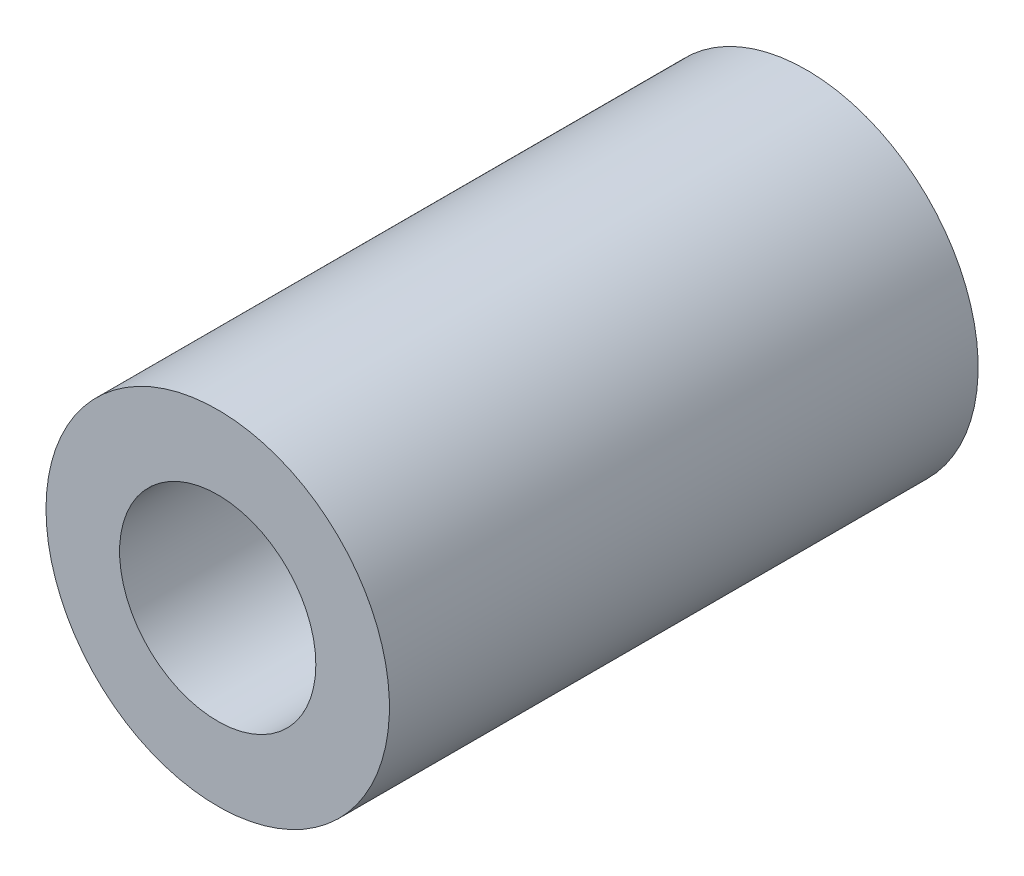
ISO-10303-21;
HEADER;
FILE_DESCRIPTION(('STEP AP214'),'2;1');
FILE_NAME('part.step','',(''),(''),'','','');
FILE_SCHEMA(('AUTOMOTIVE_DESIGN { 1 0 10303 214 1 1 1 1 }'));
ENDSEC;
DATA;
#1=APPLICATION_CONTEXT('core data for automotive mechanical design processes');
#2=APPLICATION_PROTOCOL_DEFINITION('international standard','automotive_design',2000,#1);
#3=PRODUCT_CONTEXT('',#1,'mechanical');
#4=PRODUCT('Part','Part','',(#3));
#5=PRODUCT_RELATED_PRODUCT_CATEGORY('part','',(#4));
#6=PRODUCT_DEFINITION_FORMATION('','',#4);
#7=PRODUCT_DEFINITION_CONTEXT('part definition',#1,'design');
#8=PRODUCT_DEFINITION('design','',#6,#7);
#9=PRODUCT_DEFINITION_SHAPE('','',#8);
#10=(LENGTH_UNIT() NAMED_UNIT(*) SI_UNIT(.MILLI.,.METRE.));
#11=(NAMED_UNIT(*) PLANE_ANGLE_UNIT() SI_UNIT($,.RADIAN.));
#12=(NAMED_UNIT(*) SI_UNIT($,.STERADIAN.) SOLID_ANGLE_UNIT());
#13=UNCERTAINTY_MEASURE_WITH_UNIT(LENGTH_MEASURE(1.E-05),#10,'distance_accuracy_value','');
#14=(GEOMETRIC_REPRESENTATION_CONTEXT(3) GLOBAL_UNCERTAINTY_ASSIGNED_CONTEXT((#13)) GLOBAL_UNIT_ASSIGNED_CONTEXT((#10,
#11,#12)) REPRESENTATION_CONTEXT('',''));
#15=CARTESIAN_POINT('',(0.,0.,0.));
#16=DIRECTION('',(0.,0.,1.));
#17=DIRECTION('',(1.,0.,0.));
#18=AXIS2_PLACEMENT_3D('',#15,#16,#17);
#19=CARTESIAN_POINT('',(0.,0.,19.05));
#20=DIRECTION('',(0.,0.,-1.));
#21=DIRECTION('',(-1.,0.,0.));
#22=AXIS2_PLACEMENT_3D('',#19,#20,#21);
#23=CYLINDRICAL_SURFACE('',#22,11.1125);
#24=CARTESIAN_POINT('',(0.,0.,19.05));
#25=DIRECTION('',(0.,0.,1.));
#26=DIRECTION('',(1.,0.,0.));
#27=AXIS2_PLACEMENT_3D('',#24,#25,#26);
#28=CIRCLE('',#27,11.1125);
#29=CARTESIAN_POINT('',(-11.1125,0.,19.05));
#30=VERTEX_POINT('',#29);
#31=EDGE_CURVE('E10',#30,#30,#28,.T.);
#32=CARTESIAN_POINT('',(0.,0.,-19.05));
#33=DIRECTION('',(0.,0.,1.));
#34=DIRECTION('',(1.,0.,0.));
#35=AXIS2_PLACEMENT_3D('',#32,#33,#34);
#36=CIRCLE('',#35,11.1125);
#37=CARTESIAN_POINT('',(-11.1125,0.,-19.05));
#38=VERTEX_POINT('',#37);
#39=EDGE_CURVE('E38',#38,#38,#36,.T.);
#40=CARTESIAN_POINT('',(-11.1125,0.,19.05));
#41=CARTESIAN_POINT('',(-11.1125,0.,18.653125));
#42=CARTESIAN_POINT('',(-11.1125,0.,18.25625));
#43=CARTESIAN_POINT('',(-11.1125,0.,17.4625));
#44=CARTESIAN_POINT('',(-11.1125,0.,17.065625));
#45=CARTESIAN_POINT('',(-11.1125,0.,16.271875));
#46=CARTESIAN_POINT('',(-11.1125,0.,15.875));
#47=CARTESIAN_POINT('',(-11.1125,0.,15.08125));
#48=CARTESIAN_POINT('',(-11.1125,0.,14.684375));
#49=CARTESIAN_POINT('',(-11.1125,0.,13.890625));
#50=CARTESIAN_POINT('',(-11.1125,0.,13.49375));
#51=CARTESIAN_POINT('',(-11.1125,0.,12.7));
#52=CARTESIAN_POINT('',(-11.1125,0.,12.303125));
#53=CARTESIAN_POINT('',(-11.1125,0.,11.509375));
#54=CARTESIAN_POINT('',(-11.1125,0.,11.1125));
#55=CARTESIAN_POINT('',(-11.1125,0.,10.31875));
#56=CARTESIAN_POINT('',(-11.1125,0.,9.921875));
#57=CARTESIAN_POINT('',(-11.1125,0.,9.128125));
#58=CARTESIAN_POINT('',(-11.1125,0.,8.73125));
#59=CARTESIAN_POINT('',(-11.1125,0.,7.9375));
#60=CARTESIAN_POINT('',(-11.1125,0.,7.540625));
#61=CARTESIAN_POINT('',(-11.1125,0.,6.746875));
#62=CARTESIAN_POINT('',(-11.1125,0.,6.35));
#63=CARTESIAN_POINT('',(-11.1125,0.,5.55625));
#64=CARTESIAN_POINT('',(-11.1125,0.,5.159375));
#65=CARTESIAN_POINT('',(-11.1125,0.,4.365625));
#66=CARTESIAN_POINT('',(-11.1125,0.,3.96875));
#67=CARTESIAN_POINT('',(-11.1125,0.,3.175));
#68=CARTESIAN_POINT('',(-11.1125,0.,2.778125));
#69=CARTESIAN_POINT('',(-11.1125,0.,1.984375));
#70=CARTESIAN_POINT('',(-11.1125,0.,1.5875));
#71=CARTESIAN_POINT('',(-11.1125,0.,0.79375));
#72=CARTESIAN_POINT('',(-11.1125,0.,0.396875));
#73=CARTESIAN_POINT('',(-11.1125,0.,-0.396875));
#74=CARTESIAN_POINT('',(-11.1125,0.,-0.79375));
#75=CARTESIAN_POINT('',(-11.1125,0.,-1.5875));
#76=CARTESIAN_POINT('',(-11.1125,0.,-1.984375));
#77=CARTESIAN_POINT('',(-11.1125,0.,-2.778125));
#78=CARTESIAN_POINT('',(-11.1125,0.,-3.175));
#79=CARTESIAN_POINT('',(-11.1125,0.,-3.96875));
#80=CARTESIAN_POINT('',(-11.1125,0.,-4.365625));
#81=CARTESIAN_POINT('',(-11.1125,0.,-5.159375));
#82=CARTESIAN_POINT('',(-11.1125,0.,-5.55625));
#83=CARTESIAN_POINT('',(-11.1125,0.,-6.35));
#84=CARTESIAN_POINT('',(-11.1125,0.,-6.746875));
#85=CARTESIAN_POINT('',(-11.1125,0.,-7.540625));
#86=CARTESIAN_POINT('',(-11.1125,0.,-7.9375));
#87=CARTESIAN_POINT('',(-11.1125,0.,-8.73125));
#88=CARTESIAN_POINT('',(-11.1125,0.,-9.128125));
#89=CARTESIAN_POINT('',(-11.1125,0.,-9.921875));
#90=CARTESIAN_POINT('',(-11.1125,0.,-10.31875));
#91=CARTESIAN_POINT('',(-11.1125,0.,-11.1125));
#92=CARTESIAN_POINT('',(-11.1125,0.,-11.509375));
#93=CARTESIAN_POINT('',(-11.1125,0.,-12.303125));
#94=CARTESIAN_POINT('',(-11.1125,0.,-12.7));
#95=CARTESIAN_POINT('',(-11.1125,0.,-13.49375));
#96=CARTESIAN_POINT('',(-11.1125,0.,-13.890625));
#97=CARTESIAN_POINT('',(-11.1125,0.,-14.684375));
#98=CARTESIAN_POINT('',(-11.1125,0.,-15.08125));
#99=CARTESIAN_POINT('',(-11.1125,0.,-15.875));
#100=CARTESIAN_POINT('',(-11.1125,0.,-16.271875));
#101=CARTESIAN_POINT('',(-11.1125,0.,-17.065625));
#102=CARTESIAN_POINT('',(-11.1125,0.,-17.4625));
#103=CARTESIAN_POINT('',(-11.1125,0.,-18.25625));
#104=CARTESIAN_POINT('',(-11.1125,0.,-18.653125));
#105=CARTESIAN_POINT('',(-11.1125,0.,-19.05));
#106=B_SPLINE_CURVE_WITH_KNOTS('',3,(#40,#41,#42,#43,#44,#45,#46,#47,#48,#49,#50,#51,#52,#53,
#54,#55,#56,#57,#58,#59,#60,#61,#62,#63,#64,#65,#66,#67,#68,#69,#70,#71,#72,#73,#74,#75,#76,#77,
#78,#79,#80,#81,#82,#83,#84,#85,#86,#87,#88,#89,#90,#91,#92,#93,#94,#95,#96,#97,#98,#99,#100,
#101,#102,#103,#104,#105),.UNSPECIFIED.,.F.,.F.,(4,2,2,2,2,2,2,2,2,2,2,2,2,2,2,2,2,2,2,2,2,2,2,
2,2,2,2,2,2,2,2,2,4),(0.,1.190625,2.38125,3.571875,4.7625,5.953125,7.14375,8.334375,9.525,
10.715625,11.90625,13.096875,14.2875,15.478125,16.66875,17.859375,19.05,20.240625,21.43125,
22.621875,23.8125,25.003125,26.19375,27.384375,28.575,29.765625,30.95625,32.146875,33.3375,
34.528125,35.71875,36.909375,38.1),.UNSPECIFIED.);
#107=EDGE_CURVE('BSEAM31',#30,#38,#106,.T.);
#108=ORIENTED_EDGE('',*,*,#31,.F.);
#109=ORIENTED_EDGE('',*,*,#39,.T.);
#110=ORIENTED_EDGE('',*,*,#107,.T.);
#111=ORIENTED_EDGE('',*,*,#107,.F.);
#112=EDGE_LOOP('',(#108,#110,#109,#111));
#113=FACE_BOUND('',#112,.T.);
#114=ADVANCED_FACE('F31',(#113),#23,.T.);
#115=CARTESIAN_POINT('',(0.,0.,19.05));
#116=DIRECTION('',(0.,0.,1.));
#117=DIRECTION('',(1.,0.,0.));
#118=AXIS2_PLACEMENT_3D('',#115,#116,#117);
#119=PLANE('',#118);
#120=CARTESIAN_POINT('',(0.,0.,19.05));
#121=DIRECTION('',(0.,0.,1.));
#122=DIRECTION('',(1.,0.,0.));
#123=AXIS2_PLACEMENT_3D('',#120,#121,#122);
#124=CIRCLE('',#123,6.35);
#125=CARTESIAN_POINT('',(6.35,0.,19.05));
#126=VERTEX_POINT('',#125);
#127=EDGE_CURVE('E47',#126,#126,#124,.T.);
#128=ORIENTED_EDGE('',*,*,#127,.F.);
#129=EDGE_LOOP('',(#128));
#130=FACE_BOUND('',#129,.T.);
#131=ORIENTED_EDGE('',*,*,#31,.T.);
#132=EDGE_LOOP('',(#131));
#133=FACE_BOUND('',#132,.T.);
#134=ADVANCED_FACE('F71',(#130,#133),#119,.T.);
#135=CARTESIAN_POINT('',(0.,0.,-19.05));
#136=DIRECTION('',(0.,0.,1.));
#137=DIRECTION('',(1.,0.,0.));
#138=AXIS2_PLACEMENT_3D('',#135,#136,#137);
#139=PLANE('',#138);
#140=CARTESIAN_POINT('',(0.,0.,-19.05));
#141=DIRECTION('',(0.,0.,1.));
#142=DIRECTION('',(1.,0.,0.));
#143=AXIS2_PLACEMENT_3D('',#140,#141,#142);
#144=CIRCLE('',#143,3.2639);
#145=CARTESIAN_POINT('',(3.2639,0.,-19.05));
#146=VERTEX_POINT('',#145);
#147=EDGE_CURVE('E50',#146,#146,#144,.T.);
#148=ORIENTED_EDGE('',*,*,#147,.T.);
#149=EDGE_LOOP('',(#148));
#150=FACE_BOUND('',#149,.T.);
#151=ORIENTED_EDGE('',*,*,#39,.F.);
#152=EDGE_LOOP('',(#151));
#153=FACE_BOUND('',#152,.T.);
#154=ADVANCED_FACE('F76',(#150,#153),#139,.F.);
#155=CARTESIAN_POINT('',(0.,0.,-3.302));
#156=DIRECTION('',(0.,0.,1.));
#157=DIRECTION('',(1.,0.,0.));
#158=AXIS2_PLACEMENT_3D('',#155,#156,#157);
#159=CONICAL_SURFACE('',#158,6.34999999999999,1.02974425867665);
#160=CARTESIAN_POINT('',(0.,0.,-5.15631595638095));
#161=DIRECTION('',(0.,0.,1.));
#162=DIRECTION('',(1.,0.,0.));
#163=AXIS2_PLACEMENT_3D('',#160,#161,#162);
#164=CIRCLE('',#163,3.2639);
#165=CARTESIAN_POINT('',(3.2639,0.,-5.15631595638095));
#166=VERTEX_POINT('',#165);
#167=EDGE_CURVE('E34',#166,#166,#164,.F.);
#168=ORIENTED_EDGE('',*,*,#167,.T.);
#169=EDGE_LOOP('',(#168));
#170=FACE_BOUND('',#169,.T.);
#171=CARTESIAN_POINT('',(0.,0.,-3.302));
#172=DIRECTION('',(0.,0.,1.));
#173=DIRECTION('',(1.,0.,0.));
#174=AXIS2_PLACEMENT_3D('',#171,#172,#173);
#175=CIRCLE('',#174,6.34999999999999);
#176=CARTESIAN_POINT('',(6.34999999999999,0.,-3.302));
#177=VERTEX_POINT('',#176);
#178=EDGE_CURVE('E43',#177,#177,#175,.T.);
#179=ORIENTED_EDGE('',*,*,#178,.T.);
#180=EDGE_LOOP('',(#179));
#181=FACE_BOUND('',#180,.T.);
#182=ADVANCED_FACE('F57',(#170,#181),#159,.F.);
#183=CARTESIAN_POINT('',(0.,0.,19.05));
#184=DIRECTION('',(0.,0.,1.));
#185=DIRECTION('',(1.,0.,0.));
#186=AXIS2_PLACEMENT_3D('',#183,#184,#185);
#187=CYLINDRICAL_SURFACE('',#186,6.35);
#188=ORIENTED_EDGE('',*,*,#178,.F.);
#189=EDGE_LOOP('',(#188));
#190=FACE_BOUND('',#189,.T.);
#191=ORIENTED_EDGE('',*,*,#127,.T.);
#192=EDGE_LOOP('',(#191));
#193=FACE_BOUND('',#192,.T.);
#194=ADVANCED_FACE('F62',(#190,#193),#187,.F.);
#195=CARTESIAN_POINT('',(0.,0.,-19.05));
#196=DIRECTION('',(0.,0.,1.));
#197=DIRECTION('',(1.,0.,0.));
#198=AXIS2_PLACEMENT_3D('',#195,#196,#197);
#199=CYLINDRICAL_SURFACE('',#198,3.2639);
#200=CARTESIAN_POINT('',(3.2639,0.,-19.05));
#201=CARTESIAN_POINT('',(3.2639,0.,-18.9052741245456));
#202=CARTESIAN_POINT('',(3.2639,0.,-18.7605482490913));
#203=CARTESIAN_POINT('',(3.2639,0.,-18.4710964981825));
#204=CARTESIAN_POINT('',(3.2639,0.,-18.3263706227282));
#205=CARTESIAN_POINT('',(3.2639,0.,-18.0369188718194));
#206=CARTESIAN_POINT('',(3.2639,0.,-17.8921929963651));
#207=CARTESIAN_POINT('',(3.2639,0.,-17.6027412454564));
#208=CARTESIAN_POINT('',(3.2639,0.,-17.458015370002));
#209=CARTESIAN_POINT('',(3.2639,0.,-17.1685636190933));
#210=CARTESIAN_POINT('',(3.2639,0.,-17.0238377436389));
#211=CARTESIAN_POINT('',(3.2639,0.,-16.7343859927302));
#212=CARTESIAN_POINT('',(3.2639,0.,-16.5896601172758));
#213=CARTESIAN_POINT('',(3.2639,0.,-16.3002083663671));
#214=CARTESIAN_POINT('',(3.2639,0.,-16.1554824909127));
#215=CARTESIAN_POINT('',(3.2639,0.,-15.866030740004));
#216=CARTESIAN_POINT('',(3.2639,0.,-15.7213048645496));
#217=CARTESIAN_POINT('',(3.2639,0.,-15.4318531136409));
#218=CARTESIAN_POINT('',(3.2639,0.,-15.2871272381865));
#219=CARTESIAN_POINT('',(3.2639,0.,-14.9976754872778));
#220=CARTESIAN_POINT('',(3.2639,0.,-14.8529496118234));
#221=CARTESIAN_POINT('',(3.2639,0.,-14.5634978609147));
#222=CARTESIAN_POINT('',(3.2639,0.,-14.4187719854603));
#223=CARTESIAN_POINT('',(3.2639,0.,-14.1293202345516));
#224=CARTESIAN_POINT('',(3.2639,0.,-13.9845943590972));
#225=CARTESIAN_POINT('',(3.2639,0.,-13.6951426081885));
#226=CARTESIAN_POINT('',(3.2639,0.,-13.5504167327341));
#227=CARTESIAN_POINT('',(3.2639,0.,-13.2609649818254));
#228=CARTESIAN_POINT('',(3.2639,0.,-13.116239106371));
#229=CARTESIAN_POINT('',(3.2639,0.,-12.8267873554623));
#230=CARTESIAN_POINT('',(3.2639,0.,-12.6820614800079));
#231=CARTESIAN_POINT('',(3.2639,0.,-12.3926097290992));
#232=CARTESIAN_POINT('',(3.2639,0.,-12.2478838536448));
#233=CARTESIAN_POINT('',(3.2639,0.,-11.9584321027361));
#234=CARTESIAN_POINT('',(3.2639,0.,-11.8137062272817));
#235=CARTESIAN_POINT('',(3.2639,0.,-11.524254476373));
#236=CARTESIAN_POINT('',(3.2639,0.,-11.3795286009187));
#237=CARTESIAN_POINT('',(3.2639,0.,-11.0900768500099));
#238=CARTESIAN_POINT('',(3.2639,0.,-10.9453509745556));
#239=CARTESIAN_POINT('',(3.2639,0.,-10.6558992236468));
#240=CARTESIAN_POINT('',(3.2639,0.,-10.5111733481925));
#241=CARTESIAN_POINT('',(3.2639,0.,-10.2217215972837));
#242=CARTESIAN_POINT('',(3.2639,0.,-10.0769957218294));
#243=CARTESIAN_POINT('',(3.2639,0.,-9.78754397092064));
#244=CARTESIAN_POINT('',(3.2639,0.,-9.64281809546627));
#245=CARTESIAN_POINT('',(3.2639,0.,-9.35336634455754));
#246=CARTESIAN_POINT('',(3.2639,0.,-9.20864046910318));
#247=CARTESIAN_POINT('',(3.2639,0.,-8.91918871819445));
#248=CARTESIAN_POINT('',(3.2639,0.,-8.77446284274008));
#249=CARTESIAN_POINT('',(3.2639,0.,-8.48501109183135));
#250=CARTESIAN_POINT('',(3.2639,0.,-8.34028521637699));
#251=CARTESIAN_POINT('',(3.2639,0.,-8.05083346546826));
#252=CARTESIAN_POINT('',(3.2639,0.,-7.90610759001389));
#253=CARTESIAN_POINT('',(3.2639,0.,-7.61665583910516));
#254=CARTESIAN_POINT('',(3.2639,0.,-7.47192996365079));
#255=CARTESIAN_POINT('',(3.2639,0.,-7.18247821274207));
#256=CARTESIAN_POINT('',(3.2639,0.,-7.0377523372877));
#257=CARTESIAN_POINT('',(3.2639,0.,-6.74830058637897));
#258=CARTESIAN_POINT('',(3.2639,0.,-6.6035747109246));
#259=CARTESIAN_POINT('',(3.2639,0.,-6.31412296001587));
#260=CARTESIAN_POINT('',(3.2639,0.,-6.16939708456151));
#261=CARTESIAN_POINT('',(3.2639,0.,-5.87994533365278));
#262=CARTESIAN_POINT('',(3.2639,0.,-5.73521945819841));
#263=CARTESIAN_POINT('',(3.2639,0.,-5.44576770728968));
#264=CARTESIAN_POINT('',(3.2639,0.,-5.30104183183532));
#265=CARTESIAN_POINT('',(3.2639,0.,-5.15631595638095));
#266=B_SPLINE_CURVE_WITH_KNOTS('',3,(#200,#201,#202,#203,#204,#205,#206,#207,#208,#209,#210,
#211,#212,#213,#214,#215,#216,#217,#218,#219,#220,#221,#222,#223,#224,#225,#226,#227,#228,#229,
#230,#231,#232,#233,#234,#235,#236,#237,#238,#239,#240,#241,#242,#243,#244,#245,#246,#247,#248,
#249,#250,#251,#252,#253,#254,#255,#256,#257,#258,#259,#260,#261,#262,#263,#264,#265),
.UNSPECIFIED.,.F.,.F.,(4,2,2,2,2,2,2,2,2,2,2,2,2,2,2,2,2,2,2,2,2,2,2,2,2,2,2,2,2,2,2,2,4),(0.,
0.434177626363094,0.868355252726188,1.30253287908928,1.73671050545238,2.17088813181547,
2.60506575817857,3.03924338454167,3.47342101090476,3.90759863726785,4.34177626363095,
4.77595388999405,5.21013151635714,5.64430914272024,6.07848676908333,6.51266439544643,
6.94684202180952,7.38101964817262,7.81519727453571,8.24937490089881,8.6835525272619,
9.117730153625,9.55190777998809,9.98608540635119,10.4202630327143,10.8544406590774,
11.2886182854405,11.7227959118036,12.1569735381667,12.5911511645298,13.0253287908929,
13.459506417256,13.893684043619),.UNSPECIFIED.);
#267=EDGE_CURVE('BSEAM60',#146,#166,#266,.T.);
#268=ORIENTED_EDGE('',*,*,#147,.F.);
#269=ORIENTED_EDGE('',*,*,#167,.F.);
#270=ORIENTED_EDGE('',*,*,#267,.T.);
#271=ORIENTED_EDGE('',*,*,#267,.F.);
#272=EDGE_LOOP('',(#268,#270,#269,#271));
#273=FACE_BOUND('',#272,.T.);
#274=ADVANCED_FACE('F60',(#273),#199,.F.);
#275=CLOSED_SHELL('',(#114,#134,#154,#182,#194,#274));
#276=MANIFOLD_SOLID_BREP('B2',#275);
#277=ADVANCED_BREP_SHAPE_REPRESENTATION('',(#18,#276),#14);
#278=SHAPE_DEFINITION_REPRESENTATION(#9,#277);
ENDSEC;
END-ISO-10303-21;
